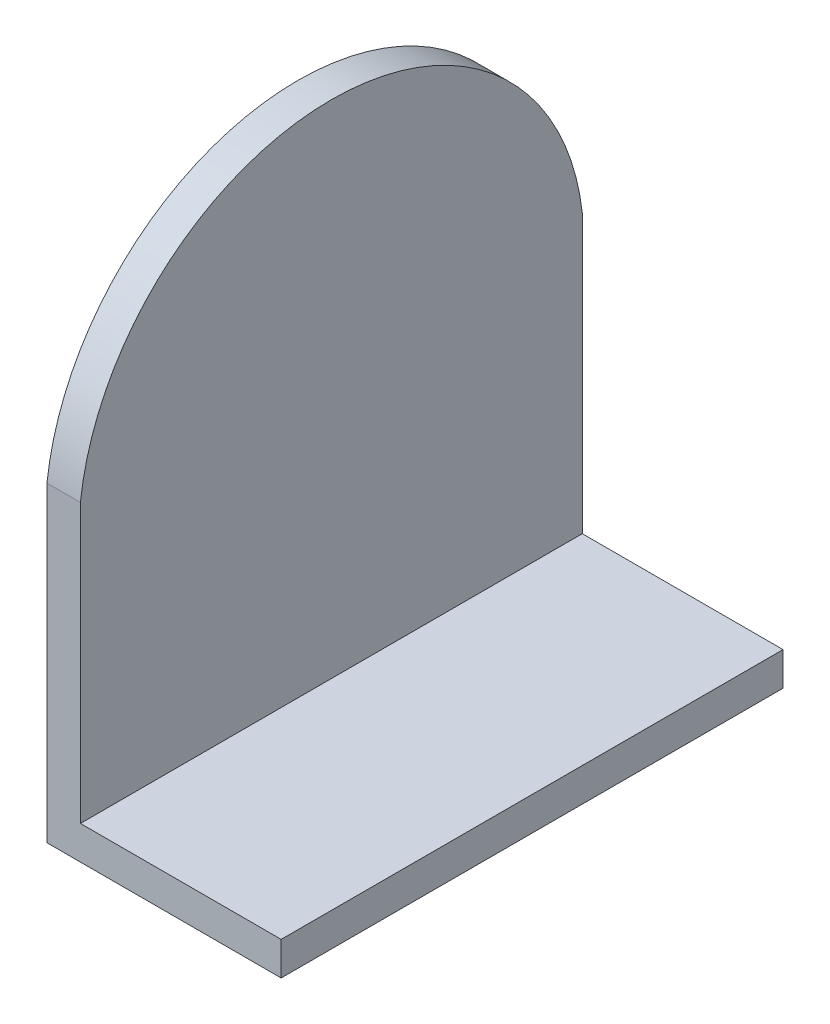
ISO-10303-21;
HEADER;
FILE_DESCRIPTION(('STEP AP214'),'2;1');
FILE_NAME('part.step','',(''),(''),'','','');
FILE_SCHEMA(('AUTOMOTIVE_DESIGN { 1 0 10303 214 1 1 1 1 }'));
ENDSEC;
DATA;
#1=APPLICATION_CONTEXT('core data for automotive mechanical design processes');
#2=APPLICATION_PROTOCOL_DEFINITION('international standard','automotive_design',2000,#1);
#3=PRODUCT_CONTEXT('',#1,'mechanical');
#4=PRODUCT('Part','Part','',(#3));
#5=PRODUCT_RELATED_PRODUCT_CATEGORY('part','',(#4));
#6=PRODUCT_DEFINITION_FORMATION('','',#4);
#7=PRODUCT_DEFINITION_CONTEXT('part definition',#1,'design');
#8=PRODUCT_DEFINITION('design','',#6,#7);
#9=PRODUCT_DEFINITION_SHAPE('','',#8);
#10=(LENGTH_UNIT() NAMED_UNIT(*) SI_UNIT(.MILLI.,.METRE.));
#11=(NAMED_UNIT(*) PLANE_ANGLE_UNIT() SI_UNIT($,.RADIAN.));
#12=(NAMED_UNIT(*) SI_UNIT($,.STERADIAN.) SOLID_ANGLE_UNIT());
#13=UNCERTAINTY_MEASURE_WITH_UNIT(LENGTH_MEASURE(1.E-05),#10,'distance_accuracy_value','');
#14=(GEOMETRIC_REPRESENTATION_CONTEXT(3) GLOBAL_UNCERTAINTY_ASSIGNED_CONTEXT((#13)) GLOBAL_UNIT_ASSIGNED_CONTEXT((#10,
#11,#12)) REPRESENTATION_CONTEXT('',''));
#15=CARTESIAN_POINT('',(0.,0.,0.));
#16=DIRECTION('',(0.,0.,1.));
#17=DIRECTION('',(1.,0.,0.));
#18=AXIS2_PLACEMENT_3D('',#15,#16,#17);
#19=CARTESIAN_POINT('',(0.,-2.,30.));
#20=DIRECTION('',(0.,1.,0.));
#21=DIRECTION('',(0.,0.,1.));
#22=AXIS2_PLACEMENT_3D('',#19,#20,#21);
#23=PLANE('',#22);
#24=DIRECTION('',(1.,0.,0.));
#25=VECTOR('',#24,1.);
#26=CARTESIAN_POINT('',(0.,-2.,0.));
#27=LINE('',#26,#25);
#28=CARTESIAN_POINT('',(-2.,-2.,0.));
#29=VERTEX_POINT('',#28);
#30=CARTESIAN_POINT('',(12.,-2.,0.));
#31=VERTEX_POINT('',#30);
#32=EDGE_CURVE('E100',#29,#31,#27,.T.);
#33=ORIENTED_EDGE('',*,*,#32,.T.);
#34=DIRECTION('',(0.,0.,-1.));
#35=VECTOR('',#34,1.);
#36=CARTESIAN_POINT('',(12.,-2.,30.));
#37=LINE('',#36,#35);
#38=CARTESIAN_POINT('',(12.,-2.,30.));
#39=VERTEX_POINT('',#38);
#40=EDGE_CURVE('E39',#39,#31,#37,.T.);
#41=ORIENTED_EDGE('',*,*,#40,.F.);
#42=DIRECTION('',(1.,0.,0.));
#43=VECTOR('',#42,1.);
#44=CARTESIAN_POINT('',(0.,-2.,30.));
#45=LINE('',#44,#43);
#46=CARTESIAN_POINT('',(-2.,-2.,30.));
#47=VERTEX_POINT('',#46);
#48=EDGE_CURVE('E81',#47,#39,#45,.T.);
#49=ORIENTED_EDGE('',*,*,#48,.F.);
#50=DIRECTION('',(0.,0.,-1.));
#51=VECTOR('',#50,1.);
#52=CARTESIAN_POINT('',(-2.,-2.,30.));
#53=LINE('',#52,#51);
#54=EDGE_CURVE('E109',#47,#29,#53,.T.);
#55=ORIENTED_EDGE('',*,*,#54,.T.);
#56=EDGE_LOOP('',(#33,#41,#49,#55));
#57=FACE_BOUND('',#56,.T.);
#58=ADVANCED_FACE('F32',(#57),#23,.F.);
#59=CARTESIAN_POINT('',(12.,0.,30.));
#60=DIRECTION('',(1.,0.,0.));
#61=DIRECTION('',(0.,0.,-1.));
#62=AXIS2_PLACEMENT_3D('',#59,#60,#61);
#63=PLANE('',#62);
#64=DIRECTION('',(0.,-1.,0.));
#65=VECTOR('',#64,1.);
#66=CARTESIAN_POINT('',(12.,0.,0.));
#67=LINE('',#66,#65);
#68=CARTESIAN_POINT('',(12.,0.,0.));
#69=VERTEX_POINT('',#68);
#70=EDGE_CURVE('E119',#69,#31,#67,.T.);
#71=ORIENTED_EDGE('',*,*,#70,.F.);
#72=DIRECTION('',(0.,0.,-1.));
#73=VECTOR('',#72,1.);
#74=CARTESIAN_POINT('',(12.,0.,30.));
#75=LINE('',#74,#73);
#76=CARTESIAN_POINT('',(12.,0.,30.));
#77=VERTEX_POINT('',#76);
#78=EDGE_CURVE('E114',#77,#69,#75,.T.);
#79=ORIENTED_EDGE('',*,*,#78,.F.);
#80=DIRECTION('',(0.,-1.,0.));
#81=VECTOR('',#80,1.);
#82=CARTESIAN_POINT('',(12.,0.,30.));
#83=LINE('',#82,#81);
#84=EDGE_CURVE('E103',#77,#39,#83,.T.);
#85=ORIENTED_EDGE('',*,*,#84,.T.);
#86=ORIENTED_EDGE('',*,*,#40,.T.);
#87=EDGE_LOOP('',(#71,#79,#85,#86));
#88=FACE_BOUND('',#87,.T.);
#89=ADVANCED_FACE('F118',(#88),#63,.T.);
#90=CARTESIAN_POINT('',(0.,0.,30.));
#91=DIRECTION('',(0.,1.,0.));
#92=DIRECTION('',(0.,0.,1.));
#93=AXIS2_PLACEMENT_3D('',#90,#91,#92);
#94=PLANE('',#93);
#95=DIRECTION('',(1.,0.,0.));
#96=VECTOR('',#95,1.);
#97=CARTESIAN_POINT('',(0.,0.,0.));
#98=LINE('',#97,#96);
#99=CARTESIAN_POINT('',(0.,0.,0.));
#100=VERTEX_POINT('',#99);
#101=EDGE_CURVE('E105',#100,#69,#98,.T.);
#102=ORIENTED_EDGE('',*,*,#101,.F.);
#103=DIRECTION('',(0.,0.,-1.));
#104=VECTOR('',#103,1.);
#105=CARTESIAN_POINT('',(0.,0.,30.));
#106=LINE('',#105,#104);
#107=CARTESIAN_POINT('',(0.,0.,30.));
#108=VERTEX_POINT('',#107);
#109=EDGE_CURVE('E111',#108,#100,#106,.T.);
#110=ORIENTED_EDGE('',*,*,#109,.F.);
#111=DIRECTION('',(1.,0.,0.));
#112=VECTOR('',#111,1.);
#113=CARTESIAN_POINT('',(0.,0.,30.));
#114=LINE('',#113,#112);
#115=EDGE_CURVE('E130',#108,#77,#114,.T.);
#116=ORIENTED_EDGE('',*,*,#115,.T.);
#117=ORIENTED_EDGE('',*,*,#78,.T.);
#118=EDGE_LOOP('',(#102,#110,#116,#117));
#119=FACE_BOUND('',#118,.T.);
#120=ADVANCED_FACE('F142',(#119),#94,.T.);
#121=CARTESIAN_POINT('',(0.,0.,30.));
#122=DIRECTION('',(1.,0.,0.));
#123=DIRECTION('',(0.,0.,-1.));
#124=AXIS2_PLACEMENT_3D('',#121,#122,#123);
#125=PLANE('',#124);
#126=CARTESIAN_POINT('',(0.,14.8646497432013,15.));
#127=DIRECTION('',(1.,0.,0.));
#128=DIRECTION('',(0.,0.,-1.));
#129=AXIS2_PLACEMENT_3D('',#126,#127,#128);
#130=CIRCLE('',#129,15.1019779312221);
#131=CARTESIAN_POINT('',(0.,16.6167163615467,30.));
#132=VERTEX_POINT('',#131);
#133=CARTESIAN_POINT('',(0.,16.6167163615467,0.));
#134=VERTEX_POINT('',#133);
#135=EDGE_CURVE('E45',#132,#134,#130,.F.);
#136=ORIENTED_EDGE('',*,*,#135,.F.);
#137=DIRECTION('',(0.,-1.,0.));
#138=VECTOR('',#137,1.);
#139=CARTESIAN_POINT('',(0.,0.,30.));
#140=LINE('',#139,#138);
#141=EDGE_CURVE('E128',#132,#108,#140,.T.);
#142=ORIENTED_EDGE('',*,*,#141,.T.);
#143=ORIENTED_EDGE('',*,*,#109,.T.);
#144=DIRECTION('',(0.,-1.,0.));
#145=VECTOR('',#144,1.);
#146=CARTESIAN_POINT('',(0.,0.,0.));
#147=LINE('',#146,#145);
#148=EDGE_CURVE('E101',#134,#100,#147,.T.);
#149=ORIENTED_EDGE('',*,*,#148,.F.);
#150=EDGE_LOOP('',(#136,#142,#143,#149));
#151=FACE_BOUND('',#150,.T.);
#152=ADVANCED_FACE('F139',(#151),#125,.T.);
#153=CARTESIAN_POINT('',(-2.,0.,30.));
#154=DIRECTION('',(1.,0.,0.));
#155=DIRECTION('',(0.,0.,-1.));
#156=AXIS2_PLACEMENT_3D('',#153,#154,#155);
#157=PLANE('',#156);
#158=DIRECTION('',(0.,1.,0.));
#159=VECTOR('',#158,1.);
#160=CARTESIAN_POINT('',(-2.,0.,30.));
#161=LINE('',#160,#159);
#162=CARTESIAN_POINT('',(-2.,16.6167163615467,30.));
#163=VERTEX_POINT('',#162);
#164=EDGE_CURVE('E54',#163,#47,#161,.F.);
#165=ORIENTED_EDGE('',*,*,#164,.F.);
#166=CARTESIAN_POINT('',(-2.,14.8646497432013,15.));
#167=DIRECTION('',(1.,0.,0.));
#168=DIRECTION('',(0.,0.,1.));
#169=AXIS2_PLACEMENT_3D('',#166,#167,#168);
#170=CIRCLE('',#169,15.1019779312221);
#171=CARTESIAN_POINT('',(-2.,16.6167163615467,0.));
#172=VERTEX_POINT('',#171);
#173=EDGE_CURVE('E91',#172,#163,#170,.T.);
#174=ORIENTED_EDGE('',*,*,#173,.F.);
#175=DIRECTION('',(0.,1.,0.));
#176=VECTOR('',#175,1.);
#177=CARTESIAN_POINT('',(-2.,0.,0.));
#178=LINE('',#177,#176);
#179=EDGE_CURVE('E76',#172,#29,#178,.F.);
#180=ORIENTED_EDGE('',*,*,#179,.T.);
#181=ORIENTED_EDGE('',*,*,#54,.F.);
#182=EDGE_LOOP('',(#165,#174,#180,#181));
#183=FACE_BOUND('',#182,.T.);
#184=ADVANCED_FACE('F94',(#183),#157,.F.);
#185=CARTESIAN_POINT('',(12.,-2.,30.));
#186=DIRECTION('',(0.,0.,-1.));
#187=DIRECTION('',(-1.,0.,0.));
#188=AXIS2_PLACEMENT_3D('',#185,#186,#187);
#189=PLANE('',#188);
#190=ORIENTED_EDGE('',*,*,#141,.F.);
#191=DIRECTION('',(-1.,0.,0.));
#192=VECTOR('',#191,1.);
#193=CARTESIAN_POINT('',(12.,16.6167163615467,30.));
#194=LINE('',#193,#192);
#195=EDGE_CURVE('E122',#132,#163,#194,.T.);
#196=ORIENTED_EDGE('',*,*,#195,.T.);
#197=ORIENTED_EDGE('',*,*,#164,.T.);
#198=ORIENTED_EDGE('',*,*,#48,.T.);
#199=ORIENTED_EDGE('',*,*,#84,.F.);
#200=ORIENTED_EDGE('',*,*,#115,.F.);
#201=EDGE_LOOP('',(#190,#196,#197,#198,#199,#200));
#202=FACE_BOUND('',#201,.T.);
#203=ADVANCED_FACE('F136',(#202),#189,.F.);
#204=CARTESIAN_POINT('',(12.,-2.,0.));
#205=DIRECTION('',(0.,0.,-1.));
#206=DIRECTION('',(-1.,0.,0.));
#207=AXIS2_PLACEMENT_3D('',#204,#205,#206);
#208=PLANE('',#207);
#209=DIRECTION('',(-1.,0.,0.));
#210=VECTOR('',#209,1.);
#211=CARTESIAN_POINT('',(12.,16.6167163615467,0.));
#212=LINE('',#211,#210);
#213=EDGE_CURVE('E11',#134,#172,#212,.T.);
#214=ORIENTED_EDGE('',*,*,#213,.F.);
#215=ORIENTED_EDGE('',*,*,#148,.T.);
#216=ORIENTED_EDGE('',*,*,#101,.T.);
#217=ORIENTED_EDGE('',*,*,#70,.T.);
#218=ORIENTED_EDGE('',*,*,#32,.F.);
#219=ORIENTED_EDGE('',*,*,#179,.F.);
#220=EDGE_LOOP('',(#214,#215,#216,#217,#218,#219));
#221=FACE_BOUND('',#220,.T.);
#222=ADVANCED_FACE('F97',(#221),#208,.T.);
#223=CARTESIAN_POINT('',(12.,14.8646497432013,15.));
#224=DIRECTION('',(-1.,0.,0.));
#225=DIRECTION('',(0.,0.,1.));
#226=AXIS2_PLACEMENT_3D('',#223,#224,#225);
#227=CYLINDRICAL_SURFACE('',#226,15.1019779312221);
#228=ORIENTED_EDGE('',*,*,#135,.T.);
#229=ORIENTED_EDGE('',*,*,#213,.T.);
#230=ORIENTED_EDGE('',*,*,#173,.T.);
#231=ORIENTED_EDGE('',*,*,#195,.F.);
#232=EDGE_LOOP('',(#228,#229,#230,#231));
#233=FACE_BOUND('',#232,.T.);
#234=ADVANCED_FACE('F90',(#233),#227,.T.);
#235=CLOSED_SHELL('',(#58,#89,#120,#152,#184,#203,#222,#234));
#236=MANIFOLD_SOLID_BREP('B2',#235);
#237=ADVANCED_BREP_SHAPE_REPRESENTATION('',(#18,#236),#14);
#238=SHAPE_DEFINITION_REPRESENTATION(#9,#237);
ENDSEC;
END-ISO-10303-21;
